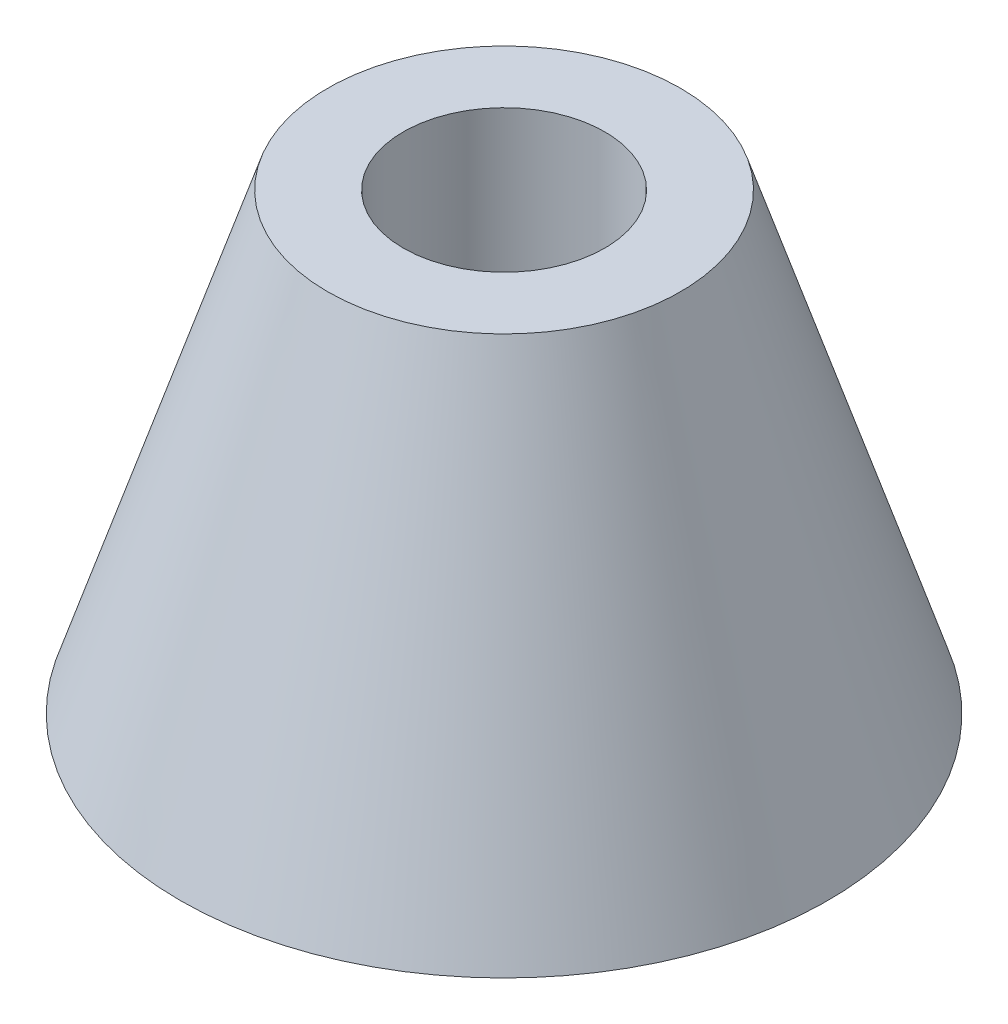
ISO-10303-21;
HEADER;
FILE_DESCRIPTION(('STEP AP214'),'2;1');
FILE_NAME('part.step','',(''),(''),'','','');
FILE_SCHEMA(('AUTOMOTIVE_DESIGN { 1 0 10303 214 1 1 1 1 }'));
ENDSEC;
DATA;
#1=APPLICATION_CONTEXT('core data for automotive mechanical design processes');
#2=APPLICATION_PROTOCOL_DEFINITION('international standard','automotive_design',2000,#1);
#3=PRODUCT_CONTEXT('',#1,'mechanical');
#4=PRODUCT('Part','Part','',(#3));
#5=PRODUCT_RELATED_PRODUCT_CATEGORY('part','',(#4));
#6=PRODUCT_DEFINITION_FORMATION('','',#4);
#7=PRODUCT_DEFINITION_CONTEXT('part definition',#1,'design');
#8=PRODUCT_DEFINITION('design','',#6,#7);
#9=PRODUCT_DEFINITION_SHAPE('','',#8);
#10=(LENGTH_UNIT() NAMED_UNIT(*) SI_UNIT(.MILLI.,.METRE.));
#11=(NAMED_UNIT(*) PLANE_ANGLE_UNIT() SI_UNIT($,.RADIAN.));
#12=(NAMED_UNIT(*) SI_UNIT($,.STERADIAN.) SOLID_ANGLE_UNIT());
#13=UNCERTAINTY_MEASURE_WITH_UNIT(LENGTH_MEASURE(1.E-05),#10,'distance_accuracy_value','');
#14=(GEOMETRIC_REPRESENTATION_CONTEXT(3) GLOBAL_UNCERTAINTY_ASSIGNED_CONTEXT((#13)) GLOBAL_UNIT_ASSIGNED_CONTEXT((#10,
#11,#12)) REPRESENTATION_CONTEXT('',''));
#15=CARTESIAN_POINT('',(0.,0.,0.));
#16=DIRECTION('',(0.,0.,1.));
#17=DIRECTION('',(1.,0.,0.));
#18=AXIS2_PLACEMENT_3D('',#15,#16,#17);
#19=CARTESIAN_POINT('',(0.,9.,0.));
#20=DIRECTION('',(0.,1.,0.));
#21=DIRECTION('',(0.,0.,1.));
#22=AXIS2_PLACEMENT_3D('',#19,#20,#21);
#23=PLANE('',#22);
#24=CARTESIAN_POINT('',(0.,9.,0.));
#25=DIRECTION('',(0.,1.,0.));
#26=DIRECTION('',(0.,0.,1.));
#27=AXIS2_PLACEMENT_3D('',#24,#25,#26);
#28=CIRCLE('',#27,3.5);
#29=CARTESIAN_POINT('',(0.,9.,3.5));
#30=VERTEX_POINT('',#29);
#31=EDGE_CURVE('E10',#30,#30,#28,.T.);
#32=ORIENTED_EDGE('',*,*,#31,.T.);
#33=EDGE_LOOP('',(#32));
#34=FACE_BOUND('',#33,.T.);
#35=CARTESIAN_POINT('',(0.,9.,0.));
#36=DIRECTION('',(0.,1.,0.));
#37=DIRECTION('',(0.,0.,1.));
#38=AXIS2_PLACEMENT_3D('',#35,#36,#37);
#39=CIRCLE('',#38,2.);
#40=CARTESIAN_POINT('',(0.,9.,2.));
#41=VERTEX_POINT('',#40);
#42=EDGE_CURVE('E43',#41,#41,#39,.T.);
#43=ORIENTED_EDGE('',*,*,#42,.F.);
#44=EDGE_LOOP('',(#43));
#45=FACE_BOUND('',#44,.T.);
#46=ADVANCED_FACE('F32',(#34,#45),#23,.T.);
#47=CARTESIAN_POINT('',(0.,0.,0.));
#48=DIRECTION('',(0.,1.,0.));
#49=DIRECTION('',(0.,0.,1.));
#50=AXIS2_PLACEMENT_3D('',#47,#48,#49);
#51=PLANE('',#50);
#52=CARTESIAN_POINT('',(0.,0.,0.));
#53=DIRECTION('',(0.,1.,0.));
#54=DIRECTION('',(0.,0.,1.));
#55=AXIS2_PLACEMENT_3D('',#52,#53,#54);
#56=CIRCLE('',#55,6.42427726609616);
#57=CARTESIAN_POINT('',(0.,0.,6.42427726609616));
#58=VERTEX_POINT('',#57);
#59=EDGE_CURVE('E36',#58,#58,#56,.T.);
#60=ORIENTED_EDGE('',*,*,#59,.F.);
#61=EDGE_LOOP('',(#60));
#62=FACE_BOUND('',#61,.T.);
#63=CARTESIAN_POINT('',(0.,0.,0.));
#64=DIRECTION('',(0.,1.,0.));
#65=DIRECTION('',(0.,0.,1.));
#66=AXIS2_PLACEMENT_3D('',#63,#64,#65);
#67=CIRCLE('',#66,2.);
#68=CARTESIAN_POINT('',(0.,0.,2.));
#69=VERTEX_POINT('',#68);
#70=EDGE_CURVE('E45',#69,#69,#67,.T.);
#71=ORIENTED_EDGE('',*,*,#70,.T.);
#72=EDGE_LOOP('',(#71));
#73=FACE_BOUND('',#72,.T.);
#74=ADVANCED_FACE('F55',(#62,#73),#51,.F.);
#75=CARTESIAN_POINT('',(0.,9.,0.));
#76=DIRECTION('',(0.,-1.,0.));
#77=DIRECTION('',(0.,0.,1.));
#78=AXIS2_PLACEMENT_3D('',#75,#76,#77);
#79=CONICAL_SURFACE('',#78,3.5,0.31415926535898);
#80=ORIENTED_EDGE('',*,*,#31,.F.);
#81=EDGE_LOOP('',(#80));
#82=FACE_BOUND('',#81,.T.);
#83=ORIENTED_EDGE('',*,*,#59,.T.);
#84=EDGE_LOOP('',(#83));
#85=FACE_BOUND('',#84,.T.);
#86=ADVANCED_FACE('F34',(#82,#85),#79,.T.);
#87=CARTESIAN_POINT('',(0.,9.,0.));
#88=DIRECTION('',(0.,-1.,0.));
#89=DIRECTION('',(0.,0.,-1.));
#90=AXIS2_PLACEMENT_3D('',#87,#88,#89);
#91=CYLINDRICAL_SURFACE('',#90,2.);
#92=ORIENTED_EDGE('',*,*,#42,.T.);
#93=EDGE_LOOP('',(#92));
#94=FACE_BOUND('',#93,.T.);
#95=ORIENTED_EDGE('',*,*,#70,.F.);
#96=EDGE_LOOP('',(#95));
#97=FACE_BOUND('',#96,.T.);
#98=ADVANCED_FACE('F51',(#94,#97),#91,.F.);
#99=CLOSED_SHELL('',(#46,#74,#86,#98));
#100=MANIFOLD_SOLID_BREP('B2',#99);
#101=ADVANCED_BREP_SHAPE_REPRESENTATION('',(#18,#100),#14);
#102=SHAPE_DEFINITION_REPRESENTATION(#9,#101);
ENDSEC;
END-ISO-10303-21;
